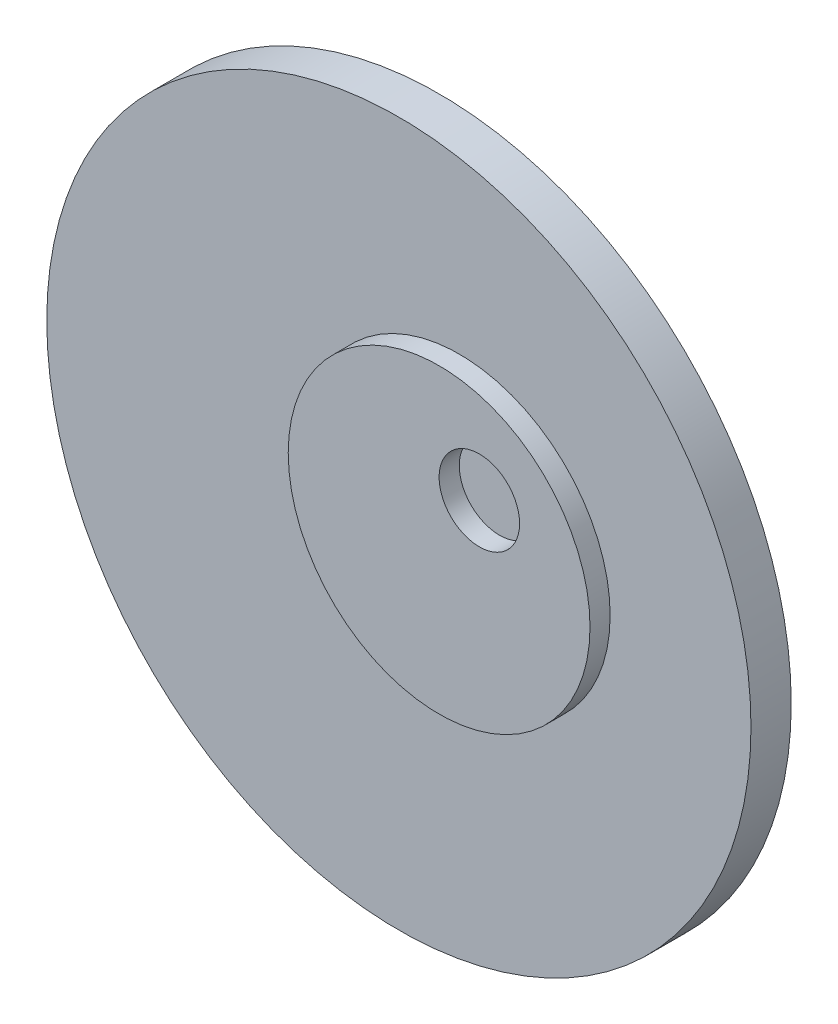
ISO-10303-21;
HEADER;
FILE_DESCRIPTION(('STEP AP214'),'2;1');
FILE_NAME('part.step','',(''),(''),'','','');
FILE_SCHEMA(('AUTOMOTIVE_DESIGN { 1 0 10303 214 1 1 1 1 }'));
ENDSEC;
DATA;
#1=APPLICATION_CONTEXT('core data for automotive mechanical design processes');
#2=APPLICATION_PROTOCOL_DEFINITION('international standard','automotive_design',2000,#1);
#3=PRODUCT_CONTEXT('',#1,'mechanical');
#4=PRODUCT('Part','Part','',(#3));
#5=PRODUCT_RELATED_PRODUCT_CATEGORY('part','',(#4));
#6=PRODUCT_DEFINITION_FORMATION('','',#4);
#7=PRODUCT_DEFINITION_CONTEXT('part definition',#1,'design');
#8=PRODUCT_DEFINITION('design','',#6,#7);
#9=PRODUCT_DEFINITION_SHAPE('','',#8);
#10=(LENGTH_UNIT() NAMED_UNIT(*) SI_UNIT(.MILLI.,.METRE.));
#11=(NAMED_UNIT(*) PLANE_ANGLE_UNIT() SI_UNIT($,.RADIAN.));
#12=(NAMED_UNIT(*) SI_UNIT($,.STERADIAN.) SOLID_ANGLE_UNIT());
#13=UNCERTAINTY_MEASURE_WITH_UNIT(LENGTH_MEASURE(1.E-05),#10,'distance_accuracy_value','');
#14=(GEOMETRIC_REPRESENTATION_CONTEXT(3) GLOBAL_UNCERTAINTY_ASSIGNED_CONTEXT((#13)) GLOBAL_UNIT_ASSIGNED_CONTEXT((#10,
#11,#12)) REPRESENTATION_CONTEXT('',''));
#15=CARTESIAN_POINT('',(0.,0.,0.));
#16=DIRECTION('',(0.,0.,1.));
#17=DIRECTION('',(1.,0.,0.));
#18=AXIS2_PLACEMENT_3D('',#15,#16,#17);
#19=CARTESIAN_POINT('',(5.,4.,3.));
#20=DIRECTION('',(0.,0.,-1.));
#21=DIRECTION('',(-1.,0.,0.));
#22=AXIS2_PLACEMENT_3D('',#19,#20,#21);
#23=CYLINDRICAL_SURFACE('',#22,2.);
#24=CARTESIAN_POINT('',(5.,4.,3.));
#25=DIRECTION('',(0.,0.,1.));
#26=DIRECTION('',(1.,0.,0.));
#27=AXIS2_PLACEMENT_3D('',#24,#25,#26);
#28=CIRCLE('',#27,2.);
#29=CARTESIAN_POINT('',(7.,4.,3.));
#30=VERTEX_POINT('',#29);
#31=EDGE_CURVE('E58',#30,#30,#28,.T.);
#32=ORIENTED_EDGE('',*,*,#31,.T.);
#33=EDGE_LOOP('',(#32));
#34=FACE_BOUND('',#33,.T.);
#35=CARTESIAN_POINT('',(5.,4.,2.));
#36=DIRECTION('',(0.,0.,1.));
#37=DIRECTION('',(1.,0.,0.));
#38=AXIS2_PLACEMENT_3D('',#35,#36,#37);
#39=CIRCLE('',#38,2.);
#40=CARTESIAN_POINT('',(7.,4.,2.));
#41=VERTEX_POINT('',#40);
#42=EDGE_CURVE('E64',#41,#41,#39,.T.);
#43=ORIENTED_EDGE('',*,*,#42,.F.);
#44=EDGE_LOOP('',(#43));
#45=FACE_BOUND('',#44,.T.);
#46=ADVANCED_FACE('F51',(#34,#45),#23,.F.);
#47=CARTESIAN_POINT('',(3.,1.3,3.));
#48=DIRECTION('',(0.,0.,-1.));
#49=DIRECTION('',(-1.,0.,0.));
#50=AXIS2_PLACEMENT_3D('',#47,#48,#49);
#51=CYLINDRICAL_SURFACE('',#50,7.5);
#52=CARTESIAN_POINT('',(3.,1.3,3.));
#53=DIRECTION('',(0.,0.,1.));
#54=DIRECTION('',(1.,0.,0.));
#55=AXIS2_PLACEMENT_3D('',#52,#53,#54);
#56=CIRCLE('',#55,7.5);
#57=CARTESIAN_POINT('',(10.5,1.3,3.));
#58=VERTEX_POINT('',#57);
#59=EDGE_CURVE('E11',#58,#58,#56,.T.);
#60=ORIENTED_EDGE('',*,*,#59,.F.);
#61=EDGE_LOOP('',(#60));
#62=FACE_BOUND('',#61,.T.);
#63=CARTESIAN_POINT('',(3.,1.3,2.));
#64=DIRECTION('',(0.,0.,1.));
#65=DIRECTION('',(1.,0.,0.));
#66=AXIS2_PLACEMENT_3D('',#63,#64,#65);
#67=CIRCLE('',#66,7.5);
#68=CARTESIAN_POINT('',(10.5,1.3,2.));
#69=VERTEX_POINT('',#68);
#70=EDGE_CURVE('E54',#69,#69,#67,.T.);
#71=ORIENTED_EDGE('',*,*,#70,.T.);
#72=EDGE_LOOP('',(#71));
#73=FACE_BOUND('',#72,.T.);
#74=ADVANCED_FACE('F71',(#62,#73),#51,.T.);
#75=CARTESIAN_POINT('',(0.,0.,3.));
#76=DIRECTION('',(0.,0.,1.));
#77=DIRECTION('',(1.,0.,0.));
#78=AXIS2_PLACEMENT_3D('',#75,#76,#77);
#79=PLANE('',#78);
#80=ORIENTED_EDGE('',*,*,#31,.F.);
#81=EDGE_LOOP('',(#80));
#82=FACE_BOUND('',#81,.T.);
#83=ORIENTED_EDGE('',*,*,#59,.T.);
#84=EDGE_LOOP('',(#83));
#85=FACE_BOUND('',#84,.T.);
#86=ADVANCED_FACE('F75',(#82,#85),#79,.T.);
#87=CARTESIAN_POINT('',(0.,0.,2.));
#88=DIRECTION('',(0.,0.,1.));
#89=DIRECTION('',(1.,0.,0.));
#90=AXIS2_PLACEMENT_3D('',#87,#88,#89);
#91=PLANE('',#90);
#92=ORIENTED_EDGE('',*,*,#42,.T.);
#93=EDGE_LOOP('',(#92));
#94=FACE_BOUND('',#93,.T.);
#95=ORIENTED_EDGE('',*,*,#70,.F.);
#96=EDGE_LOOP('',(#95));
#97=FACE_BOUND('',#96,.T.);
#98=ADVANCED_FACE('F73',(#94,#97),#91,.F.);
#99=CLOSED_SHELL('',(#46,#74,#86,#98));
#100=MANIFOLD_SOLID_BREP('B2',#99);
#101=CARTESIAN_POINT('',(0.,0.,2.));
#102=DIRECTION('',(0.,0.,-1.));
#103=DIRECTION('',(-1.,0.,0.));
#104=AXIS2_PLACEMENT_3D('',#101,#102,#103);
#105=CYLINDRICAL_SURFACE('',#104,17.5);
#106=CARTESIAN_POINT('',(0.,0.,2.));
#107=DIRECTION('',(0.,0.,1.));
#108=DIRECTION('',(1.,0.,0.));
#109=AXIS2_PLACEMENT_3D('',#106,#107,#108);
#110=CIRCLE('',#109,17.5);
#111=CARTESIAN_POINT('',(17.5,0.,2.));
#112=VERTEX_POINT('',#111);
#113=EDGE_CURVE('E50',#112,#112,#110,.T.);
#114=ORIENTED_EDGE('',*,*,#113,.F.);
#115=EDGE_LOOP('',(#114));
#116=FACE_BOUND('',#115,.T.);
#117=CARTESIAN_POINT('',(0.,0.,0.));
#118=DIRECTION('',(0.,0.,1.));
#119=DIRECTION('',(1.,0.,0.));
#120=AXIS2_PLACEMENT_3D('',#117,#118,#119);
#121=CIRCLE('',#120,17.5);
#122=CARTESIAN_POINT('',(17.5,0.,0.));
#123=VERTEX_POINT('',#122);
#124=EDGE_CURVE('E116',#123,#123,#121,.T.);
#125=ORIENTED_EDGE('',*,*,#124,.T.);
#126=EDGE_LOOP('',(#125));
#127=FACE_BOUND('',#126,.T.);
#128=ADVANCED_FACE('F113',(#116,#127),#105,.T.);
#129=CARTESIAN_POINT('',(0.,0.,2.));
#130=DIRECTION('',(0.,0.,1.));
#131=DIRECTION('',(1.,0.,0.));
#132=AXIS2_PLACEMENT_3D('',#129,#130,#131);
#133=PLANE('',#132);
#134=ORIENTED_EDGE('',*,*,#113,.T.);
#135=EDGE_LOOP('',(#134));
#136=FACE_BOUND('',#135,.T.);
#137=ADVANCED_FACE('F128',(#136),#133,.T.);
#138=CARTESIAN_POINT('',(0.,0.,0.));
#139=DIRECTION('',(0.,0.,1.));
#140=DIRECTION('',(1.,0.,0.));
#141=AXIS2_PLACEMENT_3D('',#138,#139,#140);
#142=PLANE('',#141);
#143=ORIENTED_EDGE('',*,*,#124,.F.);
#144=EDGE_LOOP('',(#143));
#145=FACE_BOUND('',#144,.T.);
#146=ADVANCED_FACE('F126',(#145),#142,.F.);
#147=CLOSED_SHELL('',(#128,#137,#146));
#148=MANIFOLD_SOLID_BREP('B6',#147);
#149=ADVANCED_BREP_SHAPE_REPRESENTATION('',(#18,#100,#148),#14);
#150=SHAPE_DEFINITION_REPRESENTATION(#9,#149);
ENDSEC;
END-ISO-10303-21;
